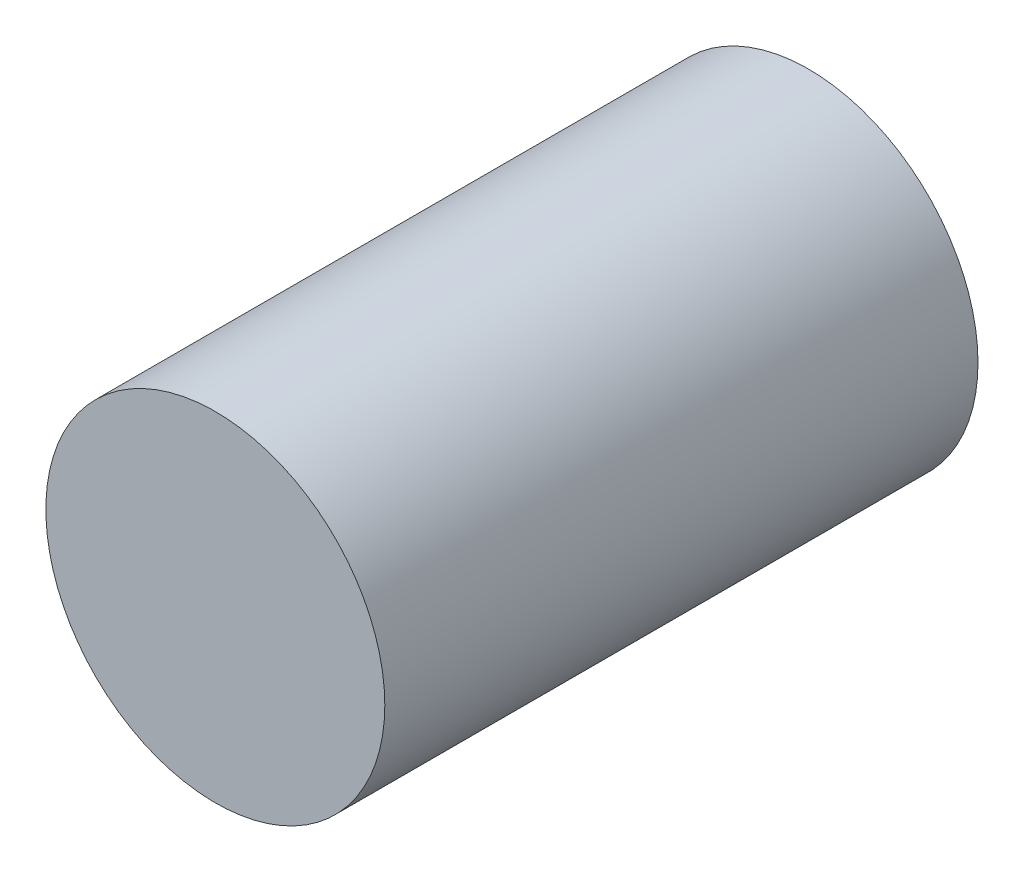
ISO-10303-21;
HEADER;
FILE_DESCRIPTION(('STEP AP214'),'2;1');
FILE_NAME('part.step','',(''),(''),'','','');
FILE_SCHEMA(('AUTOMOTIVE_DESIGN { 1 0 10303 214 1 1 1 1 }'));
ENDSEC;
DATA;
#1=APPLICATION_CONTEXT('core data for automotive mechanical design processes');
#2=APPLICATION_PROTOCOL_DEFINITION('international standard','automotive_design',2000,#1);
#3=PRODUCT_CONTEXT('',#1,'mechanical');
#4=PRODUCT('Part','Part','',(#3));
#5=PRODUCT_RELATED_PRODUCT_CATEGORY('part','',(#4));
#6=PRODUCT_DEFINITION_FORMATION('','',#4);
#7=PRODUCT_DEFINITION_CONTEXT('part definition',#1,'design');
#8=PRODUCT_DEFINITION('design','',#6,#7);
#9=PRODUCT_DEFINITION_SHAPE('','',#8);
#10=(LENGTH_UNIT() NAMED_UNIT(*) SI_UNIT(.MILLI.,.METRE.));
#11=(NAMED_UNIT(*) PLANE_ANGLE_UNIT() SI_UNIT($,.RADIAN.));
#12=(NAMED_UNIT(*) SI_UNIT($,.STERADIAN.) SOLID_ANGLE_UNIT());
#13=UNCERTAINTY_MEASURE_WITH_UNIT(LENGTH_MEASURE(1.E-05),#10,'distance_accuracy_value','');
#14=(GEOMETRIC_REPRESENTATION_CONTEXT(3) GLOBAL_UNCERTAINTY_ASSIGNED_CONTEXT((#13)) GLOBAL_UNIT_ASSIGNED_CONTEXT((#10,
#11,#12)) REPRESENTATION_CONTEXT('',''));
#15=CARTESIAN_POINT('',(0.,0.,0.));
#16=DIRECTION('',(0.,0.,1.));
#17=DIRECTION('',(1.,0.,0.));
#18=AXIS2_PLACEMENT_3D('',#15,#16,#17);
#19=CARTESIAN_POINT('',(-400.,-1650.,350.));
#20=DIRECTION('',(0.,0.,-1.));
#21=DIRECTION('',(-1.,0.,0.));
#22=AXIS2_PLACEMENT_3D('',#19,#20,#21);
#23=CYLINDRICAL_SURFACE('',#22,200.);
#24=CARTESIAN_POINT('',(-400.,-1650.,350.));
#25=DIRECTION('',(0.,0.,1.));
#26=DIRECTION('',(1.,0.,0.));
#27=AXIS2_PLACEMENT_3D('',#24,#25,#26);
#28=CIRCLE('',#27,200.);
#29=CARTESIAN_POINT('',(-200.,-1650.,350.));
#30=VERTEX_POINT('',#29);
#31=EDGE_CURVE('E10',#30,#30,#28,.T.);
#32=ORIENTED_EDGE('',*,*,#31,.F.);
#33=EDGE_LOOP('',(#32));
#34=FACE_BOUND('',#33,.T.);
#35=CARTESIAN_POINT('',(-400.,-1650.,-350.));
#36=DIRECTION('',(0.,0.,1.));
#37=DIRECTION('',(1.,0.,0.));
#38=AXIS2_PLACEMENT_3D('',#35,#36,#37);
#39=CIRCLE('',#38,200.);
#40=CARTESIAN_POINT('',(-200.,-1650.,-350.));
#41=VERTEX_POINT('',#40);
#42=EDGE_CURVE('E37',#41,#41,#39,.T.);
#43=ORIENTED_EDGE('',*,*,#42,.T.);
#44=EDGE_LOOP('',(#43));
#45=FACE_BOUND('',#44,.T.);
#46=ADVANCED_FACE('F40',(#34,#45),#23,.T.);
#47=CARTESIAN_POINT('',(-400.,-1650.,350.));
#48=DIRECTION('',(0.,0.,1.));
#49=DIRECTION('',(1.,0.,0.));
#50=AXIS2_PLACEMENT_3D('',#47,#48,#49);
#51=PLANE('',#50);
#52=ORIENTED_EDGE('',*,*,#31,.T.);
#53=EDGE_LOOP('',(#52));
#54=FACE_BOUND('',#53,.T.);
#55=ADVANCED_FACE('F55',(#54),#51,.T.);
#56=CARTESIAN_POINT('',(-400.,-1650.,-350.));
#57=DIRECTION('',(0.,0.,1.));
#58=DIRECTION('',(1.,0.,0.));
#59=AXIS2_PLACEMENT_3D('',#56,#57,#58);
#60=PLANE('',#59);
#61=ORIENTED_EDGE('',*,*,#42,.F.);
#62=EDGE_LOOP('',(#61));
#63=FACE_BOUND('',#62,.T.);
#64=ADVANCED_FACE('F49',(#63),#60,.F.);
#65=CLOSED_SHELL('',(#46,#55,#64));
#66=MANIFOLD_SOLID_BREP('B2',#65);
#67=ADVANCED_BREP_SHAPE_REPRESENTATION('',(#18,#66),#14);
#68=SHAPE_DEFINITION_REPRESENTATION(#9,#67);
ENDSEC;
END-ISO-10303-21;
